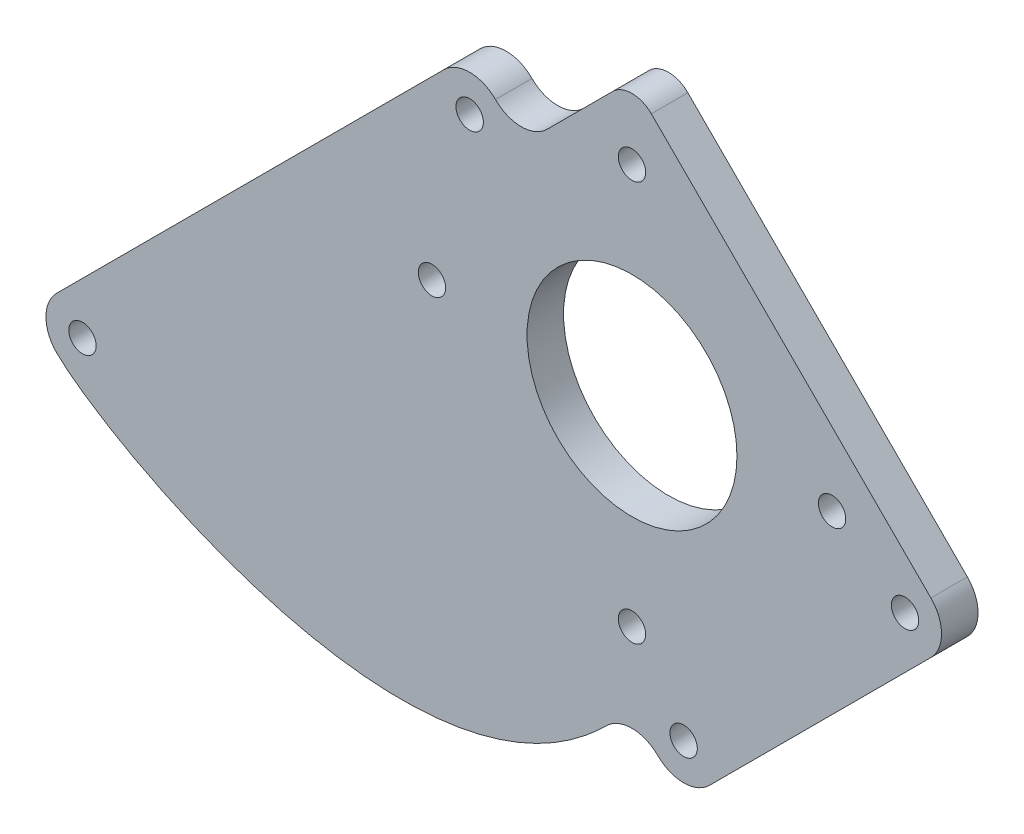
ISO-10303-21;
HEADER;
FILE_DESCRIPTION(('STEP AP214'),'2;1');
FILE_NAME('part.step','',(''),(''),'','','');
FILE_SCHEMA(('AUTOMOTIVE_DESIGN { 1 0 10303 214 1 1 1 1 }'));
ENDSEC;
DATA;
#1=APPLICATION_CONTEXT('core data for automotive mechanical design processes');
#2=APPLICATION_PROTOCOL_DEFINITION('international standard','automotive_design',2000,#1);
#3=PRODUCT_CONTEXT('',#1,'mechanical');
#4=PRODUCT('Part','Part','',(#3));
#5=PRODUCT_RELATED_PRODUCT_CATEGORY('part','',(#4));
#6=PRODUCT_DEFINITION_FORMATION('','',#4);
#7=PRODUCT_DEFINITION_CONTEXT('part definition',#1,'design');
#8=PRODUCT_DEFINITION('design','',#6,#7);
#9=PRODUCT_DEFINITION_SHAPE('','',#8);
#10=(LENGTH_UNIT() NAMED_UNIT(*) SI_UNIT(.MILLI.,.METRE.));
#11=(NAMED_UNIT(*) PLANE_ANGLE_UNIT() SI_UNIT($,.RADIAN.));
#12=(NAMED_UNIT(*) SI_UNIT($,.STERADIAN.) SOLID_ANGLE_UNIT());
#13=UNCERTAINTY_MEASURE_WITH_UNIT(LENGTH_MEASURE(1.E-05),#10,'distance_accuracy_value','');
#14=(GEOMETRIC_REPRESENTATION_CONTEXT(3) GLOBAL_UNCERTAINTY_ASSIGNED_CONTEXT((#13)) GLOBAL_UNIT_ASSIGNED_CONTEXT((#10,
#11,#12)) REPRESENTATION_CONTEXT('',''));
#15=CARTESIAN_POINT('',(0.,0.,0.));
#16=DIRECTION('',(0.,0.,1.));
#17=DIRECTION('',(1.,0.,0.));
#18=AXIS2_PLACEMENT_3D('',#15,#16,#17);
#19=CARTESIAN_POINT('',(29.9184429747659,-5.65685424949239,4.));
#20=DIRECTION('',(0.,0.,1.));
#21=DIRECTION('',(1.,0.,0.));
#22=AXIS2_PLACEMENT_3D('',#19,#20,#21);
#23=PLANE('',#22);
#24=CARTESIAN_POINT('',(-17.7876486121291,17.7876486121291,4.));
#25=DIRECTION('',(0.,0.,1.));
#26=DIRECTION('',(1.,0.,0.));
#27=AXIS2_PLACEMENT_3D('',#24,#25,#26);
#28=CIRCLE('',#27,1.5);
#29=CARTESIAN_POINT('',(-16.2876486121291,17.7876486121291,4.));
#30=VERTEX_POINT('',#29);
#31=EDGE_CURVE('E446',#30,#30,#28,.T.);
#32=ORIENTED_EDGE('',*,*,#31,.F.);
#33=EDGE_LOOP('',(#32));
#34=FACE_BOUND('',#33,.T.);
#35=CARTESIAN_POINT('',(0.,0.,4.));
#36=DIRECTION('',(0.,0.,1.));
#37=DIRECTION('',(1.,0.,0.));
#38=AXIS2_PLACEMENT_3D('',#35,#36,#37);
#39=CIRCLE('',#38,11.5);
#40=CARTESIAN_POINT('',(11.5,0.,4.));
#41=VERTEX_POINT('',#40);
#42=EDGE_CURVE('E430',#41,#41,#39,.T.);
#43=ORIENTED_EDGE('',*,*,#42,.F.);
#44=EDGE_LOOP('',(#43));
#45=FACE_BOUND('',#44,.T.);
#46=CARTESIAN_POINT('',(21.9203102167829,0.,4.));
#47=DIRECTION('',(0.,0.,1.));
#48=DIRECTION('',(1.,0.,0.));
#49=AXIS2_PLACEMENT_3D('',#46,#47,#48);
#50=CIRCLE('',#49,1.5);
#51=CARTESIAN_POINT('',(23.4203102167829,0.,4.));
#52=VERTEX_POINT('',#51);
#53=EDGE_CURVE('E415',#52,#52,#50,.T.);
#54=ORIENTED_EDGE('',*,*,#53,.F.);
#55=EDGE_LOOP('',(#54));
#56=FACE_BOUND('',#55,.T.);
#57=CARTESIAN_POINT('',(5.65685424949239,-29.9184429747659,4.));
#58=DIRECTION('',(0.,0.,1.));
#59=DIRECTION('',(1.,0.,0.));
#60=AXIS2_PLACEMENT_3D('',#57,#58,#59);
#61=CIRCLE('',#60,1.5);
#62=CARTESIAN_POINT('',(7.15685424949239,-29.9184429747659,4.));
#63=VERTEX_POINT('',#62);
#64=EDGE_CURVE('E341',#63,#63,#61,.T.);
#65=ORIENTED_EDGE('',*,*,#64,.F.);
#66=EDGE_LOOP('',(#65));
#67=FACE_BOUND('',#66,.T.);
#68=DIRECTION('',(-0.70710678118655,0.707106781186545,0.));
#69=VECTOR('',#68,1.);
#70=CARTESIAN_POINT('',(0.,29.9184429747657,4.));
#71=LINE('',#70,#69);
#72=CARTESIAN_POINT('',(32.7468700995121,-2.82842712474619,4.));
#73=VERTEX_POINT('',#72);
#74=CARTESIAN_POINT('',(2.12132034355962,27.7971226312061,4.));
#75=VERTEX_POINT('',#74);
#76=EDGE_CURVE('E139',#73,#75,#71,.T.);
#77=ORIENTED_EDGE('',*,*,#76,.T.);
#78=CARTESIAN_POINT('',(0.,25.6758022876465,4.));
#79=DIRECTION('',(0.,0.,1.));
#80=DIRECTION('',(1.,0.,0.));
#81=AXIS2_PLACEMENT_3D('',#78,#79,#80);
#82=CIRCLE('',#81,3.);
#83=CARTESIAN_POINT('',(-2.12132034355965,27.7971226312061,4.));
#84=VERTEX_POINT('',#83);
#85=EDGE_CURVE('E11',#75,#84,#82,.T.);
#86=ORIENTED_EDGE('',*,*,#85,.T.);
#87=DIRECTION('',(-0.707106781186548,-0.707106781186547,0.));
#88=VECTOR('',#87,1.);
#89=CARTESIAN_POINT('',(0.,29.9184429747657,4.));
#90=LINE('',#89,#88);
#91=CARTESIAN_POINT('',(-9.30236723789053,20.6160757368753,4.));
#92=VERTEX_POINT('',#91);
#93=EDGE_CURVE('E128',#84,#92,#90,.T.);
#94=ORIENTED_EDGE('',*,*,#93,.T.);
#95=CARTESIAN_POINT('',(-12.1307943626367,23.4445028616214,4.));
#96=DIRECTION('',(0.,0.,-1.));
#97=DIRECTION('',(1.,0.,0.));
#98=AXIS2_PLACEMENT_3D('',#95,#96,#97);
#99=CIRCLE('',#98,4.);
#100=CARTESIAN_POINT('',(-14.9592214873829,20.6160757368753,4.));
#101=VERTEX_POINT('',#100);
#102=EDGE_CURVE('E132',#92,#101,#99,.T.);
#103=ORIENTED_EDGE('',*,*,#102,.T.);
#104=CARTESIAN_POINT('',(-17.7876486121291,17.7876486121291,4.));
#105=DIRECTION('',(0.,0.,1.));
#106=DIRECTION('',(-1.,0.,0.));
#107=AXIS2_PLACEMENT_3D('',#104,#105,#106);
#108=CIRCLE('',#107,3.99999999999998);
#109=CARTESIAN_POINT('',(-20.6160757368752,20.6160757368752,4.));
#110=VERTEX_POINT('',#109);
#111=EDGE_CURVE('E155',#101,#110,#108,.T.);
#112=ORIENTED_EDGE('',*,*,#111,.T.);
#113=DIRECTION('',(-0.707106781186547,-0.707106781186548,0.));
#114=VECTOR('',#113,1.);
#115=CARTESIAN_POINT('',(-20.6160757368752,20.6160757368752,4.));
#116=LINE('',#115,#114);
#117=CARTESIAN_POINT('',(-63.0424826080681,-21.8103311343176,4.));
#118=VERTEX_POINT('',#117);
#119=EDGE_CURVE('E158',#110,#118,#116,.T.);
#120=ORIENTED_EDGE('',*,*,#119,.T.);
#121=CARTESIAN_POINT('',(-60.2140554833219,-24.6387582590638,4.));
#122=DIRECTION('',(0.,0.,1.));
#123=DIRECTION('',(1.,0.,0.));
#124=AXIS2_PLACEMENT_3D('',#121,#122,#123);
#125=CIRCLE('',#124,3.99999999999999);
#126=CARTESIAN_POINT('',(-63.0424826080681,-27.46718538381,4.));
#127=VERTEX_POINT('',#126);
#128=EDGE_CURVE('E164',#118,#127,#125,.T.);
#129=ORIENTED_EDGE('',*,*,#128,.T.);
#130=CARTESIAN_POINT('',(-63.0424826080681,-27.46718538381,4.));
#131=CARTESIAN_POINT('',(-57.2681643877833,-33.2018052531321,4.));
#132=CARTESIAN_POINT('',(-22.744659395599,-52.5904844876979,4.));
#133=CARTESIAN_POINT('',(-2.82842712474617,-32.7468700995121,4.));
#134=B_SPLINE_CURVE_WITH_KNOTS('',3,(#130,#131,#132,#133),.UNSPECIFIED.,.F.,.F.,(4,4),(0.,1.),.UNSPECIFIED.);
#135=CARTESIAN_POINT('',(-2.82842712474617,-32.7468700995121,4.));
#136=VERTEX_POINT('',#135);
#137=EDGE_CURVE('E167',#127,#136,#134,.T.);
#138=ORIENTED_EDGE('',*,*,#137,.T.);
#139=CARTESIAN_POINT('',(0.,-35.5752972242583,4.));
#140=DIRECTION('',(0.,0.,-1.));
#141=DIRECTION('',(1.,0.,0.));
#142=AXIS2_PLACEMENT_3D('',#139,#140,#141);
#143=CIRCLE('',#142,4.);
#144=CARTESIAN_POINT('',(2.8284271247462,-32.7468700995121,4.));
#145=VERTEX_POINT('',#144);
#146=EDGE_CURVE('E173',#136,#145,#143,.T.);
#147=ORIENTED_EDGE('',*,*,#146,.T.);
#148=CARTESIAN_POINT('',(5.65685424949239,-29.9184429747659,4.));
#149=DIRECTION('',(0.,0.,1.));
#150=DIRECTION('',(-1.,0.,0.));
#151=AXIS2_PLACEMENT_3D('',#148,#149,#150);
#152=CIRCLE('',#151,4.);
#153=CARTESIAN_POINT('',(8.48528137423857,-32.7468700995121,4.));
#154=VERTEX_POINT('',#153);
#155=EDGE_CURVE('E299',#145,#154,#152,.T.);
#156=ORIENTED_EDGE('',*,*,#155,.T.);
#157=DIRECTION('',(0.707106781186548,0.707106781186548,0.));
#158=VECTOR('',#157,1.);
#159=CARTESIAN_POINT('',(32.7468700995121,-8.48528137423858,4.));
#160=LINE('',#159,#158);
#161=CARTESIAN_POINT('',(32.7468700995121,-8.48528137423858,4.));
#162=VERTEX_POINT('',#161);
#163=EDGE_CURVE('E251',#154,#162,#160,.T.);
#164=ORIENTED_EDGE('',*,*,#163,.T.);
#165=CARTESIAN_POINT('',(29.9184429747659,-5.65685424949239,4.));
#166=DIRECTION('',(0.,0.,1.));
#167=DIRECTION('',(1.,0.,0.));
#168=AXIS2_PLACEMENT_3D('',#165,#166,#167);
#169=CIRCLE('',#168,4.);
#170=EDGE_CURVE('E268',#162,#73,#169,.T.);
#171=ORIENTED_EDGE('',*,*,#170,.T.);
#172=EDGE_LOOP('',(#77,#86,#94,#103,#112,#120,#129,#138,#147,#156,#164,#171));
#173=FACE_BOUND('',#172,.T.);
#174=CARTESIAN_POINT('',(0.,-21.9203102167829,4.));
#175=DIRECTION('',(0.,0.,1.));
#176=DIRECTION('',(1.,0.,0.));
#177=AXIS2_PLACEMENT_3D('',#174,#175,#176);
#178=CIRCLE('',#177,1.5);
#179=CARTESIAN_POINT('',(1.5,-21.9203102167829,4.));
#180=VERTEX_POINT('',#179);
#181=EDGE_CURVE('E332',#180,#180,#178,.T.);
#182=ORIENTED_EDGE('',*,*,#181,.F.);
#183=EDGE_LOOP('',(#182));
#184=FACE_BOUND('',#183,.T.);
#185=CARTESIAN_POINT('',(0.,21.9203102167829,4.));
#186=DIRECTION('',(0.,0.,1.));
#187=DIRECTION('',(1.,0.,0.));
#188=AXIS2_PLACEMENT_3D('',#185,#186,#187);
#189=CIRCLE('',#188,1.5);
#190=CARTESIAN_POINT('',(1.5,21.9203102167829,4.));
#191=VERTEX_POINT('',#190);
#192=EDGE_CURVE('E406',#191,#191,#189,.T.);
#193=ORIENTED_EDGE('',*,*,#192,.F.);
#194=EDGE_LOOP('',(#193));
#195=FACE_BOUND('',#194,.T.);
#196=CARTESIAN_POINT('',(-21.9203102167829,0.,4.));
#197=DIRECTION('',(0.,0.,1.));
#198=DIRECTION('',(1.,0.,0.));
#199=AXIS2_PLACEMENT_3D('',#196,#197,#198);
#200=CIRCLE('',#199,1.5);
#201=CARTESIAN_POINT('',(-20.4203102167829,0.,4.));
#202=VERTEX_POINT('',#201);
#203=EDGE_CURVE('E422',#202,#202,#200,.T.);
#204=ORIENTED_EDGE('',*,*,#203,.F.);
#205=EDGE_LOOP('',(#204));
#206=FACE_BOUND('',#205,.T.);
#207=CARTESIAN_POINT('',(29.9184429747659,-5.65685424949239,4.));
#208=DIRECTION('',(0.,0.,1.));
#209=DIRECTION('',(1.,0.,0.));
#210=AXIS2_PLACEMENT_3D('',#207,#208,#209);
#211=CIRCLE('',#210,1.5);
#212=CARTESIAN_POINT('',(31.4184429747659,-5.65685424949239,4.));
#213=VERTEX_POINT('',#212);
#214=EDGE_CURVE('E438',#213,#213,#211,.T.);
#215=ORIENTED_EDGE('',*,*,#214,.F.);
#216=EDGE_LOOP('',(#215));
#217=FACE_BOUND('',#216,.T.);
#218=CARTESIAN_POINT('',(-60.2140554833219,-24.6387582590638,4.));
#219=DIRECTION('',(0.,0.,1.));
#220=DIRECTION('',(1.,0.,0.));
#221=AXIS2_PLACEMENT_3D('',#218,#219,#220);
#222=CIRCLE('',#221,1.50000000000002);
#223=CARTESIAN_POINT('',(-58.7140554833219,-24.6387582590638,4.));
#224=VERTEX_POINT('',#223);
#225=EDGE_CURVE('E454',#224,#224,#222,.T.);
#226=ORIENTED_EDGE('',*,*,#225,.F.);
#227=EDGE_LOOP('',(#226));
#228=FACE_BOUND('',#227,.T.);
#229=ADVANCED_FACE('F39',(#34,#45,#56,#67,#173,#184,#195,#206,#217,#228),#23,.T.);
#230=CARTESIAN_POINT('',(29.9184429747659,-5.65685424949239,0.));
#231=DIRECTION('',(0.,0.,1.));
#232=DIRECTION('',(1.,0.,0.));
#233=AXIS2_PLACEMENT_3D('',#230,#231,#232);
#234=PLANE('',#233);
#235=DIRECTION('',(-0.707106781186548,-0.707106781186547,0.));
#236=VECTOR('',#235,1.);
#237=CARTESIAN_POINT('',(0.,29.9184429747657,0.));
#238=LINE('',#237,#236);
#239=CARTESIAN_POINT('',(-2.12132034355965,27.7971226312061,0.));
#240=VERTEX_POINT('',#239);
#241=CARTESIAN_POINT('',(-9.30236723789053,20.6160757368753,0.));
#242=VERTEX_POINT('',#241);
#243=EDGE_CURVE('E144',#240,#242,#238,.T.);
#244=ORIENTED_EDGE('',*,*,#243,.F.);
#245=CARTESIAN_POINT('',(0.,25.6758022876465,0.));
#246=DIRECTION('',(0.,0.,1.));
#247=DIRECTION('',(1.,0.,0.));
#248=AXIS2_PLACEMENT_3D('',#245,#246,#247);
#249=CIRCLE('',#248,3.);
#250=CARTESIAN_POINT('',(2.12132034355962,27.7971226312061,0.));
#251=VERTEX_POINT('',#250);
#252=EDGE_CURVE('E62',#240,#251,#249,.F.);
#253=ORIENTED_EDGE('',*,*,#252,.T.);
#254=DIRECTION('',(-0.70710678118655,0.707106781186545,0.));
#255=VECTOR('',#254,1.);
#256=CARTESIAN_POINT('',(0.,29.9184429747657,0.));
#257=LINE('',#256,#255);
#258=CARTESIAN_POINT('',(32.7468700995121,-2.82842712474619,0.));
#259=VERTEX_POINT('',#258);
#260=EDGE_CURVE('E330',#259,#251,#257,.T.);
#261=ORIENTED_EDGE('',*,*,#260,.F.);
#262=CARTESIAN_POINT('',(29.9184429747659,-5.65685424949239,0.));
#263=DIRECTION('',(0.,0.,1.));
#264=DIRECTION('',(1.,0.,0.));
#265=AXIS2_PLACEMENT_3D('',#262,#263,#264);
#266=CIRCLE('',#265,4.);
#267=CARTESIAN_POINT('',(32.7468700995121,-8.48528137423858,0.));
#268=VERTEX_POINT('',#267);
#269=EDGE_CURVE('E257',#268,#259,#266,.T.);
#270=ORIENTED_EDGE('',*,*,#269,.F.);
#271=DIRECTION('',(0.707106781186548,0.707106781186548,0.));
#272=VECTOR('',#271,1.);
#273=CARTESIAN_POINT('',(32.7468700995121,-8.48528137423858,0.));
#274=LINE('',#273,#272);
#275=CARTESIAN_POINT('',(8.48528137423857,-32.7468700995121,0.));
#276=VERTEX_POINT('',#275);
#277=EDGE_CURVE('E246',#276,#268,#274,.T.);
#278=ORIENTED_EDGE('',*,*,#277,.F.);
#279=CARTESIAN_POINT('',(5.65685424949239,-29.9184429747659,0.));
#280=DIRECTION('',(0.,0.,1.));
#281=DIRECTION('',(-1.,0.,0.));
#282=AXIS2_PLACEMENT_3D('',#279,#280,#281);
#283=CIRCLE('',#282,4.);
#284=CARTESIAN_POINT('',(2.8284271247462,-32.7468700995121,0.));
#285=VERTEX_POINT('',#284);
#286=EDGE_CURVE('E236',#285,#276,#283,.T.);
#287=ORIENTED_EDGE('',*,*,#286,.F.);
#288=CARTESIAN_POINT('',(0.,-35.5752972242583,0.));
#289=DIRECTION('',(0.,0.,-1.));
#290=DIRECTION('',(1.,0.,0.));
#291=AXIS2_PLACEMENT_3D('',#288,#289,#290);
#292=CIRCLE('',#291,4.);
#293=CARTESIAN_POINT('',(-2.82842712474617,-32.7468700995121,0.));
#294=VERTEX_POINT('',#293);
#295=EDGE_CURVE('E247',#294,#285,#292,.T.);
#296=ORIENTED_EDGE('',*,*,#295,.F.);
#297=CARTESIAN_POINT('',(-63.0424826080681,-27.46718538381,0.));
#298=CARTESIAN_POINT('',(-57.2681643877833,-33.2018052531321,0.));
#299=CARTESIAN_POINT('',(-22.744659395599,-52.5904844876979,0.));
#300=CARTESIAN_POINT('',(-2.82842712474617,-32.7468700995121,0.));
#301=B_SPLINE_CURVE_WITH_KNOTS('',3,(#297,#298,#299,#300),.UNSPECIFIED.,.F.,.F.,(4,4),(0.,1.),.UNSPECIFIED.);
#302=CARTESIAN_POINT('',(-63.0424826080681,-27.46718538381,0.));
#303=VERTEX_POINT('',#302);
#304=EDGE_CURVE('E307',#303,#294,#301,.T.);
#305=ORIENTED_EDGE('',*,*,#304,.F.);
#306=CARTESIAN_POINT('',(-60.2140554833219,-24.6387582590638,0.));
#307=DIRECTION('',(0.,0.,1.));
#308=DIRECTION('',(1.,0.,0.));
#309=AXIS2_PLACEMENT_3D('',#306,#307,#308);
#310=CIRCLE('',#309,3.99999999999999);
#311=CARTESIAN_POINT('',(-63.0424826080681,-21.8103311343176,0.));
#312=VERTEX_POINT('',#311);
#313=EDGE_CURVE('E309',#312,#303,#310,.T.);
#314=ORIENTED_EDGE('',*,*,#313,.F.);
#315=DIRECTION('',(-0.707106781186547,-0.707106781186548,0.));
#316=VECTOR('',#315,1.);
#317=CARTESIAN_POINT('',(-20.6160757368752,20.6160757368752,0.));
#318=LINE('',#317,#316);
#319=CARTESIAN_POINT('',(-20.6160757368752,20.6160757368752,0.));
#320=VERTEX_POINT('',#319);
#321=EDGE_CURVE('E319',#320,#312,#318,.T.);
#322=ORIENTED_EDGE('',*,*,#321,.F.);
#323=CARTESIAN_POINT('',(-17.7876486121291,17.7876486121291,0.));
#324=DIRECTION('',(0.,0.,1.));
#325=DIRECTION('',(-1.,0.,0.));
#326=AXIS2_PLACEMENT_3D('',#323,#324,#325);
#327=CIRCLE('',#326,3.99999999999998);
#328=CARTESIAN_POINT('',(-14.9592214873829,20.6160757368753,0.));
#329=VERTEX_POINT('',#328);
#330=EDGE_CURVE('E322',#329,#320,#327,.T.);
#331=ORIENTED_EDGE('',*,*,#330,.F.);
#332=CARTESIAN_POINT('',(-12.1307943626367,23.4445028616214,0.));
#333=DIRECTION('',(0.,0.,-1.));
#334=DIRECTION('',(1.,0.,0.));
#335=AXIS2_PLACEMENT_3D('',#332,#333,#334);
#336=CIRCLE('',#335,4.);
#337=EDGE_CURVE('E325',#242,#329,#336,.T.);
#338=ORIENTED_EDGE('',*,*,#337,.F.);
#339=EDGE_LOOP('',(#244,#253,#261,#270,#278,#287,#296,#305,#314,#322,#331,#338));
#340=FACE_BOUND('',#339,.T.);
#341=CARTESIAN_POINT('',(0.,-21.9203102167829,0.));
#342=DIRECTION('',(0.,0.,1.));
#343=DIRECTION('',(1.,0.,0.));
#344=AXIS2_PLACEMENT_3D('',#341,#342,#343);
#345=CIRCLE('',#344,1.5);
#346=CARTESIAN_POINT('',(1.5,-21.9203102167829,0.));
#347=VERTEX_POINT('',#346);
#348=EDGE_CURVE('E335',#347,#347,#345,.T.);
#349=ORIENTED_EDGE('',*,*,#348,.T.);
#350=EDGE_LOOP('',(#349));
#351=FACE_BOUND('',#350,.T.);
#352=CARTESIAN_POINT('',(5.65685424949239,-29.9184429747659,0.));
#353=DIRECTION('',(0.,0.,1.));
#354=DIRECTION('',(1.,0.,0.));
#355=AXIS2_PLACEMENT_3D('',#352,#353,#354);
#356=CIRCLE('',#355,1.5);
#357=CARTESIAN_POINT('',(7.15685424949239,-29.9184429747659,0.));
#358=VERTEX_POINT('',#357);
#359=EDGE_CURVE('E344',#358,#358,#356,.T.);
#360=ORIENTED_EDGE('',*,*,#359,.T.);
#361=EDGE_LOOP('',(#360));
#362=FACE_BOUND('',#361,.T.);
#363=CARTESIAN_POINT('',(0.,21.9203102167829,0.));
#364=DIRECTION('',(0.,0.,1.));
#365=DIRECTION('',(1.,0.,0.));
#366=AXIS2_PLACEMENT_3D('',#363,#364,#365);
#367=CIRCLE('',#366,1.5);
#368=CARTESIAN_POINT('',(1.5,21.9203102167829,0.));
#369=VERTEX_POINT('',#368);
#370=EDGE_CURVE('E410',#369,#369,#367,.T.);
#371=ORIENTED_EDGE('',*,*,#370,.T.);
#372=EDGE_LOOP('',(#371));
#373=FACE_BOUND('',#372,.T.);
#374=CARTESIAN_POINT('',(21.9203102167829,0.,0.));
#375=DIRECTION('',(0.,0.,1.));
#376=DIRECTION('',(1.,0.,0.));
#377=AXIS2_PLACEMENT_3D('',#374,#375,#376);
#378=CIRCLE('',#377,1.5);
#379=CARTESIAN_POINT('',(23.4203102167829,0.,0.));
#380=VERTEX_POINT('',#379);
#381=EDGE_CURVE('E418',#380,#380,#378,.T.);
#382=ORIENTED_EDGE('',*,*,#381,.T.);
#383=EDGE_LOOP('',(#382));
#384=FACE_BOUND('',#383,.T.);
#385=CARTESIAN_POINT('',(-21.9203102167829,0.,0.));
#386=DIRECTION('',(0.,0.,1.));
#387=DIRECTION('',(1.,0.,0.));
#388=AXIS2_PLACEMENT_3D('',#385,#386,#387);
#389=CIRCLE('',#388,1.5);
#390=CARTESIAN_POINT('',(-20.4203102167829,0.,0.));
#391=VERTEX_POINT('',#390);
#392=EDGE_CURVE('E426',#391,#391,#389,.T.);
#393=ORIENTED_EDGE('',*,*,#392,.T.);
#394=EDGE_LOOP('',(#393));
#395=FACE_BOUND('',#394,.T.);
#396=CARTESIAN_POINT('',(0.,0.,0.));
#397=DIRECTION('',(0.,0.,1.));
#398=DIRECTION('',(1.,0.,0.));
#399=AXIS2_PLACEMENT_3D('',#396,#397,#398);
#400=CIRCLE('',#399,11.5);
#401=CARTESIAN_POINT('',(11.5,0.,0.));
#402=VERTEX_POINT('',#401);
#403=EDGE_CURVE('E434',#402,#402,#400,.T.);
#404=ORIENTED_EDGE('',*,*,#403,.T.);
#405=EDGE_LOOP('',(#404));
#406=FACE_BOUND('',#405,.T.);
#407=CARTESIAN_POINT('',(29.9184429747659,-5.65685424949239,0.));
#408=DIRECTION('',(0.,0.,1.));
#409=DIRECTION('',(1.,0.,0.));
#410=AXIS2_PLACEMENT_3D('',#407,#408,#409);
#411=CIRCLE('',#410,1.5);
#412=CARTESIAN_POINT('',(31.4184429747659,-5.65685424949239,0.));
#413=VERTEX_POINT('',#412);
#414=EDGE_CURVE('E442',#413,#413,#411,.T.);
#415=ORIENTED_EDGE('',*,*,#414,.T.);
#416=EDGE_LOOP('',(#415));
#417=FACE_BOUND('',#416,.T.);
#418=CARTESIAN_POINT('',(-17.7876486121291,17.7876486121291,0.));
#419=DIRECTION('',(0.,0.,1.));
#420=DIRECTION('',(1.,0.,0.));
#421=AXIS2_PLACEMENT_3D('',#418,#419,#420);
#422=CIRCLE('',#421,1.5);
#423=CARTESIAN_POINT('',(-16.2876486121291,17.7876486121291,0.));
#424=VERTEX_POINT('',#423);
#425=EDGE_CURVE('E450',#424,#424,#422,.T.);
#426=ORIENTED_EDGE('',*,*,#425,.T.);
#427=EDGE_LOOP('',(#426));
#428=FACE_BOUND('',#427,.T.);
#429=CARTESIAN_POINT('',(-60.2140554833219,-24.6387582590638,0.));
#430=DIRECTION('',(0.,0.,1.));
#431=DIRECTION('',(1.,0.,0.));
#432=AXIS2_PLACEMENT_3D('',#429,#430,#431);
#433=CIRCLE('',#432,1.50000000000002);
#434=CARTESIAN_POINT('',(-58.7140554833219,-24.6387582590638,0.));
#435=VERTEX_POINT('',#434);
#436=EDGE_CURVE('E458',#435,#435,#433,.T.);
#437=ORIENTED_EDGE('',*,*,#436,.T.);
#438=EDGE_LOOP('',(#437));
#439=FACE_BOUND('',#438,.T.);
#440=ADVANCED_FACE('F203',(#340,#351,#362,#373,#384,#395,#406,#417,#428,#439),#234,.F.);
#441=CARTESIAN_POINT('',(0.,29.9184429747657,4.));
#442=DIRECTION('',(-0.707106781186545,-0.70710678118655,0.));
#443=DIRECTION('',(0.70710678118655,-0.707106781186545,0.));
#444=AXIS2_PLACEMENT_3D('',#441,#442,#443);
#445=PLANE('',#444);
#446=ORIENTED_EDGE('',*,*,#260,.T.);
#447=DIRECTION('',(0.,0.,-1.));
#448=VECTOR('',#447,1.);
#449=CARTESIAN_POINT('',(2.12132034355962,27.7971226312061,4.));
#450=LINE('',#449,#448);
#451=EDGE_CURVE('E48',#251,#75,#450,.F.);
#452=ORIENTED_EDGE('',*,*,#451,.T.);
#453=ORIENTED_EDGE('',*,*,#76,.F.);
#454=DIRECTION('',(0.,0.,-1.));
#455=VECTOR('',#454,1.);
#456=CARTESIAN_POINT('',(32.7468700995121,-2.82842712474619,4.));
#457=LINE('',#456,#455);
#458=EDGE_CURVE('E264',#73,#259,#457,.T.);
#459=ORIENTED_EDGE('',*,*,#458,.T.);
#460=EDGE_LOOP('',(#446,#452,#453,#459));
#461=FACE_BOUND('',#460,.T.);
#462=ADVANCED_FACE('F201',(#461),#445,.F.);
#463=CARTESIAN_POINT('',(0.,29.9184429747657,4.));
#464=DIRECTION('',(0.707106781186547,-0.707106781186548,0.));
#465=DIRECTION('',(0.707106781186548,0.707106781186547,0.));
#466=AXIS2_PLACEMENT_3D('',#463,#464,#465);
#467=PLANE('',#466);
#468=ORIENTED_EDGE('',*,*,#93,.F.);
#469=DIRECTION('',(0.,0.,-1.));
#470=VECTOR('',#469,1.);
#471=CARTESIAN_POINT('',(-2.12132034355965,27.7971226312061,4.));
#472=LINE('',#471,#470);
#473=EDGE_CURVE('E148',#84,#240,#472,.T.);
#474=ORIENTED_EDGE('',*,*,#473,.T.);
#475=ORIENTED_EDGE('',*,*,#243,.T.);
#476=DIRECTION('',(0.,0.,-1.));
#477=VECTOR('',#476,1.);
#478=CARTESIAN_POINT('',(-9.30236723789053,20.6160757368753,4.));
#479=LINE('',#478,#477);
#480=EDGE_CURVE('E142',#92,#242,#479,.T.);
#481=ORIENTED_EDGE('',*,*,#480,.F.);
#482=EDGE_LOOP('',(#468,#474,#475,#481));
#483=FACE_BOUND('',#482,.T.);
#484=ADVANCED_FACE('F143',(#483),#467,.F.);
#485=CARTESIAN_POINT('',(-12.1307943626367,23.4445028616214,4.));
#486=DIRECTION('',(0.,0.,-1.));
#487=DIRECTION('',(-1.,0.,0.));
#488=AXIS2_PLACEMENT_3D('',#485,#486,#487);
#489=CYLINDRICAL_SURFACE('',#488,4.);
#490=ORIENTED_EDGE('',*,*,#337,.T.);
#491=DIRECTION('',(0.,0.,-1.));
#492=VECTOR('',#491,1.);
#493=CARTESIAN_POINT('',(-14.9592214873829,20.6160757368753,4.));
#494=LINE('',#493,#492);
#495=EDGE_CURVE('E149',#101,#329,#494,.T.);
#496=ORIENTED_EDGE('',*,*,#495,.F.);
#497=ORIENTED_EDGE('',*,*,#102,.F.);
#498=ORIENTED_EDGE('',*,*,#480,.T.);
#499=EDGE_LOOP('',(#490,#496,#497,#498));
#500=FACE_BOUND('',#499,.T.);
#501=ADVANCED_FACE('F151',(#500),#489,.F.);
#502=CARTESIAN_POINT('',(-17.7876486121291,17.7876486121291,4.));
#503=DIRECTION('',(0.,0.,-1.));
#504=DIRECTION('',(-1.,0.,0.));
#505=AXIS2_PLACEMENT_3D('',#502,#503,#504);
#506=CYLINDRICAL_SURFACE('',#505,3.99999999999998);
#507=ORIENTED_EDGE('',*,*,#330,.T.);
#508=DIRECTION('',(0.,0.,-1.));
#509=VECTOR('',#508,1.);
#510=CARTESIAN_POINT('',(-20.6160757368752,20.6160757368752,4.));
#511=LINE('',#510,#509);
#512=EDGE_CURVE('E285',#110,#320,#511,.T.);
#513=ORIENTED_EDGE('',*,*,#512,.F.);
#514=ORIENTED_EDGE('',*,*,#111,.F.);
#515=ORIENTED_EDGE('',*,*,#495,.T.);
#516=EDGE_LOOP('',(#507,#513,#514,#515));
#517=FACE_BOUND('',#516,.T.);
#518=ADVANCED_FACE('F193',(#517),#506,.T.);
#519=CARTESIAN_POINT('',(-20.6160757368752,20.6160757368752,4.));
#520=DIRECTION('',(0.707106781186548,-0.707106781186547,0.));
#521=DIRECTION('',(0.707106781186547,0.707106781186548,0.));
#522=AXIS2_PLACEMENT_3D('',#519,#520,#521);
#523=PLANE('',#522);
#524=ORIENTED_EDGE('',*,*,#321,.T.);
#525=DIRECTION('',(0.,0.,-1.));
#526=VECTOR('',#525,1.);
#527=CARTESIAN_POINT('',(-63.0424826080681,-21.8103311343176,4.));
#528=LINE('',#527,#526);
#529=EDGE_CURVE('E281',#118,#312,#528,.T.);
#530=ORIENTED_EDGE('',*,*,#529,.F.);
#531=ORIENTED_EDGE('',*,*,#119,.F.);
#532=ORIENTED_EDGE('',*,*,#512,.T.);
#533=EDGE_LOOP('',(#524,#530,#531,#532));
#534=FACE_BOUND('',#533,.T.);
#535=ADVANCED_FACE('F189',(#534),#523,.F.);
#536=CARTESIAN_POINT('',(-60.2140554833219,-24.6387582590638,4.));
#537=DIRECTION('',(0.,0.,-1.));
#538=DIRECTION('',(-1.,0.,0.));
#539=AXIS2_PLACEMENT_3D('',#536,#537,#538);
#540=CYLINDRICAL_SURFACE('',#539,3.99999999999999);
#541=ORIENTED_EDGE('',*,*,#313,.T.);
#542=DIRECTION('',(0.,0.,-1.));
#543=VECTOR('',#542,1.);
#544=CARTESIAN_POINT('',(-63.0424826080681,-27.46718538381,4.));
#545=LINE('',#544,#543);
#546=EDGE_CURVE('E277',#127,#303,#545,.T.);
#547=ORIENTED_EDGE('',*,*,#546,.F.);
#548=ORIENTED_EDGE('',*,*,#128,.F.);
#549=ORIENTED_EDGE('',*,*,#529,.T.);
#550=EDGE_LOOP('',(#541,#547,#548,#549));
#551=FACE_BOUND('',#550,.T.);
#552=ADVANCED_FACE('F184',(#551),#540,.T.);
#553=DIRECTION('',(0.,0.,-1.));
#554=VECTOR('',#553,1.);
#555=SURFACE_OF_LINEAR_EXTRUSION('',#134,#554);
#556=ORIENTED_EDGE('',*,*,#304,.T.);
#557=DIRECTION('',(0.,0.,-1.));
#558=VECTOR('',#557,1.);
#559=CARTESIAN_POINT('',(-2.82842712474617,-32.7468700995121,4.));
#560=LINE('',#559,#558);
#561=EDGE_CURVE('E273',#136,#294,#560,.T.);
#562=ORIENTED_EDGE('',*,*,#561,.F.);
#563=ORIENTED_EDGE('',*,*,#137,.F.);
#564=ORIENTED_EDGE('',*,*,#546,.T.);
#565=EDGE_LOOP('',(#556,#562,#563,#564));
#566=FACE_BOUND('',#565,.T.);
#567=ADVANCED_FACE('F179',(#566),#555,.F.);
#568=CARTESIAN_POINT('',(0.,-35.5752972242583,4.));
#569=DIRECTION('',(0.,0.,-1.));
#570=DIRECTION('',(-1.,0.,0.));
#571=AXIS2_PLACEMENT_3D('',#568,#569,#570);
#572=CYLINDRICAL_SURFACE('',#571,4.);
#573=ORIENTED_EDGE('',*,*,#295,.T.);
#574=DIRECTION('',(0.,0.,-1.));
#575=VECTOR('',#574,1.);
#576=CARTESIAN_POINT('',(2.8284271247462,-32.7468700995121,4.));
#577=LINE('',#576,#575);
#578=EDGE_CURVE('E242',#145,#285,#577,.T.);
#579=ORIENTED_EDGE('',*,*,#578,.F.);
#580=ORIENTED_EDGE('',*,*,#146,.F.);
#581=ORIENTED_EDGE('',*,*,#561,.T.);
#582=EDGE_LOOP('',(#573,#579,#580,#581));
#583=FACE_BOUND('',#582,.T.);
#584=ADVANCED_FACE('F183',(#583),#572,.F.);
#585=CARTESIAN_POINT('',(5.65685424949239,-29.9184429747659,4.));
#586=DIRECTION('',(0.,0.,-1.));
#587=DIRECTION('',(-1.,0.,0.));
#588=AXIS2_PLACEMENT_3D('',#585,#586,#587);
#589=CYLINDRICAL_SURFACE('',#588,4.);
#590=ORIENTED_EDGE('',*,*,#286,.T.);
#591=DIRECTION('',(0.,0.,-1.));
#592=VECTOR('',#591,1.);
#593=CARTESIAN_POINT('',(8.48528137423857,-32.7468700995121,4.));
#594=LINE('',#593,#592);
#595=EDGE_CURVE('E239',#154,#276,#594,.T.);
#596=ORIENTED_EDGE('',*,*,#595,.F.);
#597=ORIENTED_EDGE('',*,*,#155,.F.);
#598=ORIENTED_EDGE('',*,*,#578,.T.);
#599=EDGE_LOOP('',(#590,#596,#597,#598));
#600=FACE_BOUND('',#599,.T.);
#601=ADVANCED_FACE('F225',(#600),#589,.T.);
#602=CARTESIAN_POINT('',(32.7468700995121,-8.48528137423858,4.));
#603=DIRECTION('',(-0.707106781186547,0.707106781186547,0.));
#604=DIRECTION('',(-0.707106781186548,-0.707106781186548,0.));
#605=AXIS2_PLACEMENT_3D('',#602,#603,#604);
#606=PLANE('',#605);
#607=ORIENTED_EDGE('',*,*,#277,.T.);
#608=DIRECTION('',(0.,0.,-1.));
#609=VECTOR('',#608,1.);
#610=CARTESIAN_POINT('',(32.7468700995121,-8.48528137423858,4.));
#611=LINE('',#610,#609);
#612=EDGE_CURVE('E253',#162,#268,#611,.T.);
#613=ORIENTED_EDGE('',*,*,#612,.F.);
#614=ORIENTED_EDGE('',*,*,#163,.F.);
#615=ORIENTED_EDGE('',*,*,#595,.T.);
#616=EDGE_LOOP('',(#607,#613,#614,#615));
#617=FACE_BOUND('',#616,.T.);
#618=ADVANCED_FACE('F222',(#617),#606,.F.);
#619=CARTESIAN_POINT('',(29.9184429747659,-5.65685424949239,4.));
#620=DIRECTION('',(0.,0.,-1.));
#621=DIRECTION('',(-1.,0.,0.));
#622=AXIS2_PLACEMENT_3D('',#619,#620,#621);
#623=CYLINDRICAL_SURFACE('',#622,4.);
#624=ORIENTED_EDGE('',*,*,#269,.T.);
#625=ORIENTED_EDGE('',*,*,#458,.F.);
#626=ORIENTED_EDGE('',*,*,#170,.F.);
#627=ORIENTED_EDGE('',*,*,#612,.T.);
#628=EDGE_LOOP('',(#624,#625,#626,#627));
#629=FACE_BOUND('',#628,.T.);
#630=ADVANCED_FACE('F219',(#629),#623,.T.);
#631=CARTESIAN_POINT('',(0.,-21.9203102167829,4.));
#632=DIRECTION('',(0.,0.,-1.));
#633=DIRECTION('',(-1.,0.,0.));
#634=AXIS2_PLACEMENT_3D('',#631,#632,#633);
#635=CYLINDRICAL_SURFACE('',#634,1.5);
#636=ORIENTED_EDGE('',*,*,#181,.T.);
#637=EDGE_LOOP('',(#636));
#638=FACE_BOUND('',#637,.T.);
#639=ORIENTED_EDGE('',*,*,#348,.F.);
#640=EDGE_LOOP('',(#639));
#641=FACE_BOUND('',#640,.T.);
#642=ADVANCED_FACE('F216',(#638,#641),#635,.F.);
#643=CARTESIAN_POINT('',(5.65685424949239,-29.9184429747659,4.));
#644=DIRECTION('',(0.,0.,-1.));
#645=DIRECTION('',(-1.,0.,0.));
#646=AXIS2_PLACEMENT_3D('',#643,#644,#645);
#647=CYLINDRICAL_SURFACE('',#646,1.5);
#648=ORIENTED_EDGE('',*,*,#64,.T.);
#649=EDGE_LOOP('',(#648));
#650=FACE_BOUND('',#649,.T.);
#651=ORIENTED_EDGE('',*,*,#359,.F.);
#652=EDGE_LOOP('',(#651));
#653=FACE_BOUND('',#652,.T.);
#654=ADVANCED_FACE('F392',(#650,#653),#647,.F.);
#655=CARTESIAN_POINT('',(0.,21.9203102167829,4.));
#656=DIRECTION('',(0.,0.,-1.));
#657=DIRECTION('',(-1.,0.,0.));
#658=AXIS2_PLACEMENT_3D('',#655,#656,#657);
#659=CYLINDRICAL_SURFACE('',#658,1.5);
#660=ORIENTED_EDGE('',*,*,#192,.T.);
#661=EDGE_LOOP('',(#660));
#662=FACE_BOUND('',#661,.T.);
#663=ORIENTED_EDGE('',*,*,#370,.F.);
#664=EDGE_LOOP('',(#663));
#665=FACE_BOUND('',#664,.T.);
#666=ADVANCED_FACE('F389',(#662,#665),#659,.F.);
#667=CARTESIAN_POINT('',(21.9203102167829,0.,4.));
#668=DIRECTION('',(0.,0.,-1.));
#669=DIRECTION('',(-1.,0.,0.));
#670=AXIS2_PLACEMENT_3D('',#667,#668,#669);
#671=CYLINDRICAL_SURFACE('',#670,1.5);
#672=ORIENTED_EDGE('',*,*,#53,.T.);
#673=EDGE_LOOP('',(#672));
#674=FACE_BOUND('',#673,.T.);
#675=ORIENTED_EDGE('',*,*,#381,.F.);
#676=EDGE_LOOP('',(#675));
#677=FACE_BOUND('',#676,.T.);
#678=ADVANCED_FACE('F385',(#674,#677),#671,.F.);
#679=CARTESIAN_POINT('',(-21.9203102167829,0.,4.));
#680=DIRECTION('',(0.,0.,-1.));
#681=DIRECTION('',(-1.,0.,0.));
#682=AXIS2_PLACEMENT_3D('',#679,#680,#681);
#683=CYLINDRICAL_SURFACE('',#682,1.5);
#684=ORIENTED_EDGE('',*,*,#203,.T.);
#685=EDGE_LOOP('',(#684));
#686=FACE_BOUND('',#685,.T.);
#687=ORIENTED_EDGE('',*,*,#392,.F.);
#688=EDGE_LOOP('',(#687));
#689=FACE_BOUND('',#688,.T.);
#690=ADVANCED_FACE('F381',(#686,#689),#683,.F.);
#691=CARTESIAN_POINT('',(0.,0.,4.));
#692=DIRECTION('',(0.,0.,-1.));
#693=DIRECTION('',(-1.,0.,0.));
#694=AXIS2_PLACEMENT_3D('',#691,#692,#693);
#695=CYLINDRICAL_SURFACE('',#694,11.5);
#696=ORIENTED_EDGE('',*,*,#42,.T.);
#697=EDGE_LOOP('',(#696));
#698=FACE_BOUND('',#697,.T.);
#699=ORIENTED_EDGE('',*,*,#403,.F.);
#700=EDGE_LOOP('',(#699));
#701=FACE_BOUND('',#700,.T.);
#702=ADVANCED_FACE('F377',(#698,#701),#695,.F.);
#703=CARTESIAN_POINT('',(29.9184429747659,-5.65685424949239,4.));
#704=DIRECTION('',(0.,0.,-1.));
#705=DIRECTION('',(-1.,0.,0.));
#706=AXIS2_PLACEMENT_3D('',#703,#704,#705);
#707=CYLINDRICAL_SURFACE('',#706,1.5);
#708=ORIENTED_EDGE('',*,*,#214,.T.);
#709=EDGE_LOOP('',(#708));
#710=FACE_BOUND('',#709,.T.);
#711=ORIENTED_EDGE('',*,*,#414,.F.);
#712=EDGE_LOOP('',(#711));
#713=FACE_BOUND('',#712,.T.);
#714=ADVANCED_FACE('F369',(#710,#713),#707,.F.);
#715=CARTESIAN_POINT('',(-17.7876486121291,17.7876486121291,4.));
#716=DIRECTION('',(0.,0.,-1.));
#717=DIRECTION('',(-1.,0.,0.));
#718=AXIS2_PLACEMENT_3D('',#715,#716,#717);
#719=CYLINDRICAL_SURFACE('',#718,1.5);
#720=ORIENTED_EDGE('',*,*,#31,.T.);
#721=EDGE_LOOP('',(#720));
#722=FACE_BOUND('',#721,.T.);
#723=ORIENTED_EDGE('',*,*,#425,.F.);
#724=EDGE_LOOP('',(#723));
#725=FACE_BOUND('',#724,.T.);
#726=ADVANCED_FACE('F363',(#722,#725),#719,.F.);
#727=CARTESIAN_POINT('',(-60.2140554833219,-24.6387582590638,4.));
#728=DIRECTION('',(0.,0.,-1.));
#729=DIRECTION('',(-1.,0.,0.));
#730=AXIS2_PLACEMENT_3D('',#727,#728,#729);
#731=CYLINDRICAL_SURFACE('',#730,1.50000000000002);
#732=ORIENTED_EDGE('',*,*,#225,.T.);
#733=EDGE_LOOP('',(#732));
#734=FACE_BOUND('',#733,.T.);
#735=ORIENTED_EDGE('',*,*,#436,.F.);
#736=EDGE_LOOP('',(#735));
#737=FACE_BOUND('',#736,.T.);
#738=ADVANCED_FACE('F359',(#734,#737),#731,.F.);
#739=CARTESIAN_POINT('',(0.,25.6758022876465,4.));
#740=DIRECTION('',(0.,0.,-1.));
#741=DIRECTION('',(-1.,0.,0.));
#742=AXIS2_PLACEMENT_3D('',#739,#740,#741);
#743=CYLINDRICAL_SURFACE('',#742,3.);
#744=ORIENTED_EDGE('',*,*,#85,.F.);
#745=ORIENTED_EDGE('',*,*,#451,.F.);
#746=ORIENTED_EDGE('',*,*,#252,.F.);
#747=ORIENTED_EDGE('',*,*,#473,.F.);
#748=EDGE_LOOP('',(#744,#745,#746,#747));
#749=FACE_BOUND('',#748,.T.);
#750=ADVANCED_FACE('F41',(#749),#743,.T.);
#751=CLOSED_SHELL('',(#229,#440,#462,#484,#501,#518,#535,#552,#567,#584,#601,#618,#630,#642,
#654,#666,#678,#690,#702,#714,#726,#738,#750));
#752=MANIFOLD_SOLID_BREP('B2',#751);
#753=ADVANCED_BREP_SHAPE_REPRESENTATION('',(#18,#752),#14);
#754=SHAPE_DEFINITION_REPRESENTATION(#9,#753);
ENDSEC;
END-ISO-10303-21;
